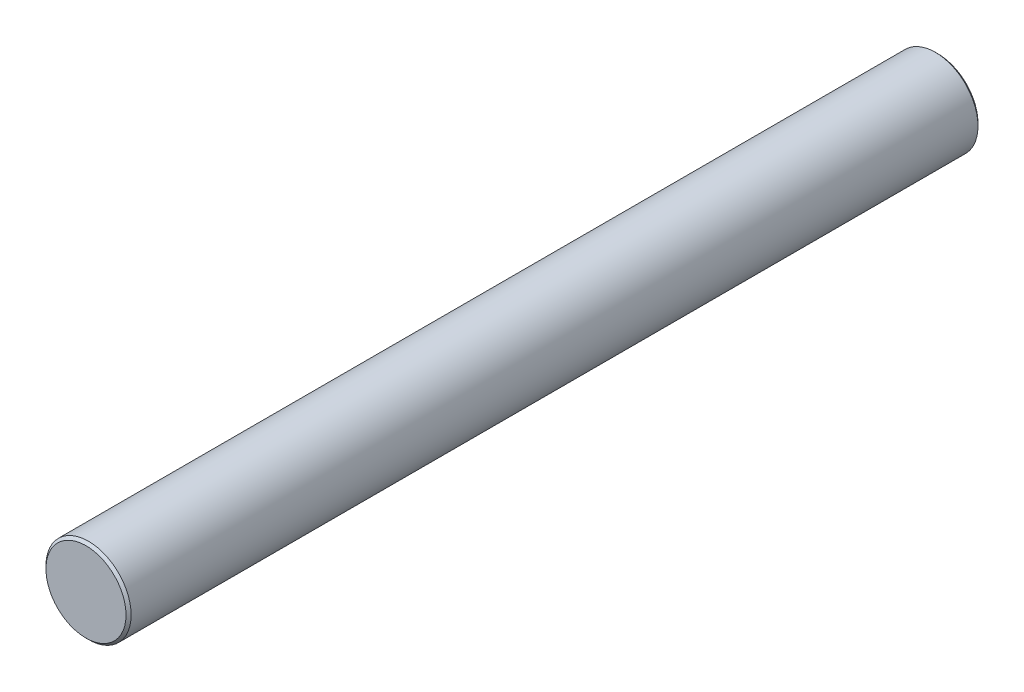
ISO-10303-21;
HEADER;
FILE_DESCRIPTION(('STEP AP214'),'2;1');
FILE_NAME('part.step','',(''),(''),'','','');
FILE_SCHEMA(('AUTOMOTIVE_DESIGN { 1 0 10303 214 1 1 1 1 }'));
ENDSEC;
DATA;
#1=APPLICATION_CONTEXT('core data for automotive mechanical design processes');
#2=APPLICATION_PROTOCOL_DEFINITION('international standard','automotive_design',2000,#1);
#3=PRODUCT_CONTEXT('',#1,'mechanical');
#4=PRODUCT('Part','Part','',(#3));
#5=PRODUCT_RELATED_PRODUCT_CATEGORY('part','',(#4));
#6=PRODUCT_DEFINITION_FORMATION('','',#4);
#7=PRODUCT_DEFINITION_CONTEXT('part definition',#1,'design');
#8=PRODUCT_DEFINITION('design','',#6,#7);
#9=PRODUCT_DEFINITION_SHAPE('','',#8);
#10=(LENGTH_UNIT() NAMED_UNIT(*) SI_UNIT(.MILLI.,.METRE.));
#11=(NAMED_UNIT(*) PLANE_ANGLE_UNIT() SI_UNIT($,.RADIAN.));
#12=(NAMED_UNIT(*) SI_UNIT($,.STERADIAN.) SOLID_ANGLE_UNIT());
#13=UNCERTAINTY_MEASURE_WITH_UNIT(LENGTH_MEASURE(1.E-05),#10,'distance_accuracy_value','');
#14=(GEOMETRIC_REPRESENTATION_CONTEXT(3) GLOBAL_UNCERTAINTY_ASSIGNED_CONTEXT((#13)) GLOBAL_UNIT_ASSIGNED_CONTEXT((#10,
#11,#12)) REPRESENTATION_CONTEXT('',''));
#15=CARTESIAN_POINT('',(0.,0.,0.));
#16=DIRECTION('',(0.,0.,1.));
#17=DIRECTION('',(1.,0.,0.));
#18=AXIS2_PLACEMENT_3D('',#15,#16,#17);
#19=CARTESIAN_POINT('',(0.,0.,50.));
#20=DIRECTION('',(0.,0.,-1.));
#21=DIRECTION('',(-1.,0.,0.));
#22=AXIS2_PLACEMENT_3D('',#19,#20,#21);
#23=CYLINDRICAL_SURFACE('',#22,5.);
#24=CARTESIAN_POINT('',(0.,0.,-49.7));
#25=DIRECTION('',(0.,0.,1.));
#26=DIRECTION('',(1.,0.,0.));
#27=AXIS2_PLACEMENT_3D('',#24,#25,#26);
#28=CIRCLE('',#27,5.);
#29=CARTESIAN_POINT('',(5.,0.,-49.7));
#30=VERTEX_POINT('',#29);
#31=EDGE_CURVE('E46',#30,#30,#28,.T.);
#32=ORIENTED_EDGE('',*,*,#31,.T.);
#33=EDGE_LOOP('',(#32));
#34=FACE_BOUND('',#33,.T.);
#35=CARTESIAN_POINT('',(0.,0.,49.7));
#36=DIRECTION('',(0.,0.,1.));
#37=DIRECTION('',(1.,0.,0.));
#38=AXIS2_PLACEMENT_3D('',#35,#36,#37);
#39=CIRCLE('',#38,5.);
#40=CARTESIAN_POINT('',(5.,0.,49.7));
#41=VERTEX_POINT('',#40);
#42=EDGE_CURVE('E50',#41,#41,#39,.F.);
#43=ORIENTED_EDGE('',*,*,#42,.T.);
#44=EDGE_LOOP('',(#43));
#45=FACE_BOUND('',#44,.T.);
#46=ADVANCED_FACE('F35',(#34,#45),#23,.T.);
#47=CARTESIAN_POINT('',(0.,0.,50.));
#48=DIRECTION('',(0.,0.,1.));
#49=DIRECTION('',(1.,0.,0.));
#50=AXIS2_PLACEMENT_3D('',#47,#48,#49);
#51=PLANE('',#50);
#52=CARTESIAN_POINT('',(0.,0.,50.));
#53=DIRECTION('',(0.,0.,1.));
#54=DIRECTION('',(1.,0.,0.));
#55=AXIS2_PLACEMENT_3D('',#52,#53,#54);
#56=CIRCLE('',#55,4.7);
#57=CARTESIAN_POINT('',(4.7,0.,50.));
#58=VERTEX_POINT('',#57);
#59=EDGE_CURVE('E10',#58,#58,#56,.T.);
#60=ORIENTED_EDGE('',*,*,#59,.T.);
#61=EDGE_LOOP('',(#60));
#62=FACE_BOUND('',#61,.T.);
#63=ADVANCED_FACE('F66',(#62),#51,.T.);
#64=CARTESIAN_POINT('',(0.,0.,-50.));
#65=DIRECTION('',(0.,0.,1.));
#66=DIRECTION('',(1.,0.,0.));
#67=AXIS2_PLACEMENT_3D('',#64,#65,#66);
#68=PLANE('',#67);
#69=CARTESIAN_POINT('',(0.,0.,-50.));
#70=DIRECTION('',(0.,0.,1.));
#71=DIRECTION('',(1.,0.,0.));
#72=AXIS2_PLACEMENT_3D('',#69,#70,#71);
#73=CIRCLE('',#72,4.69999999999998);
#74=CARTESIAN_POINT('',(4.69999999999998,0.,-50.));
#75=VERTEX_POINT('',#74);
#76=EDGE_CURVE('E42',#75,#75,#73,.F.);
#77=ORIENTED_EDGE('',*,*,#76,.T.);
#78=EDGE_LOOP('',(#77));
#79=FACE_BOUND('',#78,.T.);
#80=ADVANCED_FACE('F63',(#79),#68,.F.);
#81=CARTESIAN_POINT('',(0.,0.,-49.7));
#82=DIRECTION('',(0.,0.,1.));
#83=DIRECTION('',(1.,0.,0.));
#84=AXIS2_PLACEMENT_3D('',#81,#82,#83);
#85=CONICAL_SURFACE('',#84,5.,0.785398163397463);
#86=ORIENTED_EDGE('',*,*,#76,.F.);
#87=EDGE_LOOP('',(#86));
#88=FACE_BOUND('',#87,.T.);
#89=ORIENTED_EDGE('',*,*,#31,.F.);
#90=EDGE_LOOP('',(#89));
#91=FACE_BOUND('',#90,.T.);
#92=ADVANCED_FACE('F59',(#88,#91),#85,.T.);
#93=CARTESIAN_POINT('',(0.,0.,50.));
#94=DIRECTION('',(0.,0.,-1.));
#95=DIRECTION('',(-1.,0.,0.));
#96=AXIS2_PLACEMENT_3D('',#93,#94,#95);
#97=CONICAL_SURFACE('',#96,4.7,0.785398163397451);
#98=ORIENTED_EDGE('',*,*,#42,.F.);
#99=EDGE_LOOP('',(#98));
#100=FACE_BOUND('',#99,.T.);
#101=ORIENTED_EDGE('',*,*,#59,.F.);
#102=EDGE_LOOP('',(#101));
#103=FACE_BOUND('',#102,.T.);
#104=ADVANCED_FACE('F37',(#100,#103),#97,.T.);
#105=CLOSED_SHELL('',(#46,#63,#80,#92,#104));
#106=MANIFOLD_SOLID_BREP('B2',#105);
#107=ADVANCED_BREP_SHAPE_REPRESENTATION('',(#18,#106),#14);
#108=SHAPE_DEFINITION_REPRESENTATION(#9,#107);
ENDSEC;
END-ISO-10303-21;
